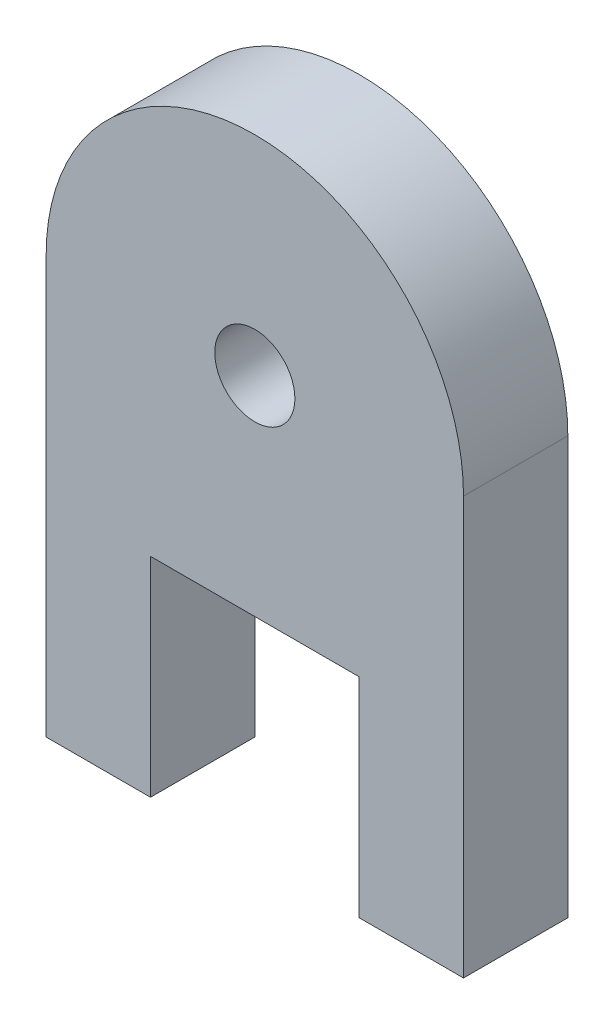
ISO-10303-21;
HEADER;
FILE_DESCRIPTION(('STEP AP214'),'2;1');
FILE_NAME('part.step','',(''),(''),'','','');
FILE_SCHEMA(('AUTOMOTIVE_DESIGN { 1 0 10303 214 1 1 1 1 }'));
ENDSEC;
DATA;
#1=APPLICATION_CONTEXT('core data for automotive mechanical design processes');
#2=APPLICATION_PROTOCOL_DEFINITION('international standard','automotive_design',2000,#1);
#3=PRODUCT_CONTEXT('',#1,'mechanical');
#4=PRODUCT('Part','Part','',(#3));
#5=PRODUCT_RELATED_PRODUCT_CATEGORY('part','',(#4));
#6=PRODUCT_DEFINITION_FORMATION('','',#4);
#7=PRODUCT_DEFINITION_CONTEXT('part definition',#1,'design');
#8=PRODUCT_DEFINITION('design','',#6,#7);
#9=PRODUCT_DEFINITION_SHAPE('','',#8);
#10=(LENGTH_UNIT() NAMED_UNIT(*) SI_UNIT(.MILLI.,.METRE.));
#11=(NAMED_UNIT(*) PLANE_ANGLE_UNIT() SI_UNIT($,.RADIAN.));
#12=(NAMED_UNIT(*) SI_UNIT($,.STERADIAN.) SOLID_ANGLE_UNIT());
#13=UNCERTAINTY_MEASURE_WITH_UNIT(LENGTH_MEASURE(1.E-05),#10,'distance_accuracy_value','');
#14=(GEOMETRIC_REPRESENTATION_CONTEXT(3) GLOBAL_UNCERTAINTY_ASSIGNED_CONTEXT((#13)) GLOBAL_UNIT_ASSIGNED_CONTEXT((#10,
#11,#12)) REPRESENTATION_CONTEXT('',''));
#15=CARTESIAN_POINT('',(0.,0.,0.));
#16=DIRECTION('',(0.,0.,1.));
#17=DIRECTION('',(1.,0.,0.));
#18=AXIS2_PLACEMENT_3D('',#15,#16,#17);
#19=CARTESIAN_POINT('',(-3.175,-6.35,1.5875));
#20=DIRECTION('',(0.,1.,0.));
#21=DIRECTION('',(0.,0.,1.));
#22=AXIS2_PLACEMENT_3D('',#19,#20,#21);
#23=PLANE('',#22);
#24=DIRECTION('',(1.,0.,0.));
#25=VECTOR('',#24,1.);
#26=CARTESIAN_POINT('',(-3.175,-6.35,1.5875));
#27=LINE('',#26,#25);
#28=CARTESIAN_POINT('',(1.5875,-6.35,1.5875));
#29=VERTEX_POINT('',#28);
#30=CARTESIAN_POINT('',(3.175,-6.35,1.5875));
#31=VERTEX_POINT('',#30);
#32=EDGE_CURVE('E126',#29,#31,#27,.T.);
#33=ORIENTED_EDGE('',*,*,#32,.F.);
#34=DIRECTION('',(0.,0.,-1.));
#35=VECTOR('',#34,1.);
#36=CARTESIAN_POINT('',(1.5875,-6.35,1.5875));
#37=LINE('',#36,#35);
#38=CARTESIAN_POINT('',(1.5875,-6.35,0.));
#39=VERTEX_POINT('',#38);
#40=EDGE_CURVE('E111',#29,#39,#37,.T.);
#41=ORIENTED_EDGE('',*,*,#40,.T.);
#42=DIRECTION('',(1.,0.,0.));
#43=VECTOR('',#42,1.);
#44=CARTESIAN_POINT('',(-3.175,-6.35,0.));
#45=LINE('',#44,#43);
#46=CARTESIAN_POINT('',(3.175,-6.35,0.));
#47=VERTEX_POINT('',#46);
#48=EDGE_CURVE('E147',#39,#47,#45,.T.);
#49=ORIENTED_EDGE('',*,*,#48,.T.);
#50=DIRECTION('',(0.,0.,-1.));
#51=VECTOR('',#50,1.);
#52=CARTESIAN_POINT('',(3.175,-6.35,1.5875));
#53=LINE('',#52,#51);
#54=EDGE_CURVE('E131',#31,#47,#53,.T.);
#55=ORIENTED_EDGE('',*,*,#54,.F.);
#56=EDGE_LOOP('',(#33,#41,#49,#55));
#57=FACE_BOUND('',#56,.T.);
#58=ADVANCED_FACE('F37',(#57),#23,.F.);
#59=CARTESIAN_POINT('',(0.,0.,1.5875));
#60=DIRECTION('',(0.,0.,-1.));
#61=DIRECTION('',(-1.,0.,0.));
#62=AXIS2_PLACEMENT_3D('',#59,#60,#61);
#63=PLANE('',#62);
#64=DIRECTION('',(1.,0.,0.));
#65=VECTOR('',#64,1.);
#66=CARTESIAN_POINT('',(1.5875,-3.175,1.5875));
#67=LINE('',#66,#65);
#68=CARTESIAN_POINT('',(-1.5875,-3.175,1.5875));
#69=VERTEX_POINT('',#68);
#70=CARTESIAN_POINT('',(1.5875,-3.175,1.5875));
#71=VERTEX_POINT('',#70);
#72=EDGE_CURVE('E122',#69,#71,#67,.T.);
#73=ORIENTED_EDGE('',*,*,#72,.T.);
#74=DIRECTION('',(0.,-1.,0.));
#75=VECTOR('',#74,1.);
#76=CARTESIAN_POINT('',(1.5875,-6.35,1.5875));
#77=LINE('',#76,#75);
#78=EDGE_CURVE('E114',#71,#29,#77,.T.);
#79=ORIENTED_EDGE('',*,*,#78,.T.);
#80=ORIENTED_EDGE('',*,*,#32,.T.);
#81=DIRECTION('',(0.,1.,0.));
#82=VECTOR('',#81,1.);
#83=CARTESIAN_POINT('',(3.175,-6.35,1.5875));
#84=LINE('',#83,#82);
#85=CARTESIAN_POINT('',(3.175,0.,1.5875));
#86=VERTEX_POINT('',#85);
#87=EDGE_CURVE('E61',#31,#86,#84,.T.);
#88=ORIENTED_EDGE('',*,*,#87,.T.);
#89=CARTESIAN_POINT('',(0.,0.,1.5875));
#90=DIRECTION('',(0.,0.,1.));
#91=DIRECTION('',(-1.,0.,0.));
#92=AXIS2_PLACEMENT_3D('',#89,#90,#91);
#93=CIRCLE('',#92,3.175);
#94=CARTESIAN_POINT('',(-3.175,0.,1.5875));
#95=VERTEX_POINT('',#94);
#96=EDGE_CURVE('E135',#86,#95,#93,.T.);
#97=ORIENTED_EDGE('',*,*,#96,.T.);
#98=DIRECTION('',(0.,-1.,0.));
#99=VECTOR('',#98,1.);
#100=CARTESIAN_POINT('',(-3.175,0.,1.5875));
#101=LINE('',#100,#99);
#102=CARTESIAN_POINT('',(-3.175,-6.35,1.5875));
#103=VERTEX_POINT('',#102);
#104=EDGE_CURVE('E89',#95,#103,#101,.T.);
#105=ORIENTED_EDGE('',*,*,#104,.T.);
#106=CARTESIAN_POINT('',(-1.5875,-6.35,1.5875));
#107=VERTEX_POINT('',#106);
#108=EDGE_CURVE('E132',#103,#107,#27,.T.);
#109=ORIENTED_EDGE('',*,*,#108,.T.);
#110=DIRECTION('',(0.,1.,0.));
#111=VECTOR('',#110,1.);
#112=CARTESIAN_POINT('',(-1.5875,-6.35,1.5875));
#113=LINE('',#112,#111);
#114=EDGE_CURVE('E52',#107,#69,#113,.T.);
#115=ORIENTED_EDGE('',*,*,#114,.T.);
#116=EDGE_LOOP('',(#73,#79,#80,#88,#97,#105,#109,#115));
#117=FACE_BOUND('',#116,.T.);
#118=CARTESIAN_POINT('',(0.,0.,1.5875));
#119=DIRECTION('',(0.,0.,1.));
#120=DIRECTION('',(1.,0.,0.));
#121=AXIS2_PLACEMENT_3D('',#118,#119,#120);
#122=CIRCLE('',#121,0.6096);
#123=CARTESIAN_POINT('',(0.6096,0.,1.5875));
#124=VERTEX_POINT('',#123);
#125=EDGE_CURVE('E145',#124,#124,#122,.T.);
#126=ORIENTED_EDGE('',*,*,#125,.F.);
#127=EDGE_LOOP('',(#126));
#128=FACE_BOUND('',#127,.T.);
#129=ADVANCED_FACE('F124',(#117,#128),#63,.F.);
#130=CARTESIAN_POINT('',(0.,0.,0.));
#131=DIRECTION('',(0.,0.,-1.));
#132=DIRECTION('',(-1.,0.,0.));
#133=AXIS2_PLACEMENT_3D('',#130,#131,#132);
#134=PLANE('',#133);
#135=DIRECTION('',(0.,-1.,0.));
#136=VECTOR('',#135,1.);
#137=CARTESIAN_POINT('',(1.5875,-6.35,0.));
#138=LINE('',#137,#136);
#139=CARTESIAN_POINT('',(1.5875,-3.175,0.));
#140=VERTEX_POINT('',#139);
#141=EDGE_CURVE('E117',#140,#39,#138,.T.);
#142=ORIENTED_EDGE('',*,*,#141,.F.);
#143=DIRECTION('',(1.,0.,0.));
#144=VECTOR('',#143,1.);
#145=CARTESIAN_POINT('',(1.5875,-3.175,0.));
#146=LINE('',#145,#144);
#147=CARTESIAN_POINT('',(-1.5875,-3.175,0.));
#148=VERTEX_POINT('',#147);
#149=EDGE_CURVE('E129',#148,#140,#146,.T.);
#150=ORIENTED_EDGE('',*,*,#149,.F.);
#151=DIRECTION('',(0.,1.,0.));
#152=VECTOR('',#151,1.);
#153=CARTESIAN_POINT('',(-1.5875,-6.35,0.));
#154=LINE('',#153,#152);
#155=CARTESIAN_POINT('',(-1.5875,-6.35,0.));
#156=VERTEX_POINT('',#155);
#157=EDGE_CURVE('E165',#156,#148,#154,.T.);
#158=ORIENTED_EDGE('',*,*,#157,.F.);
#159=CARTESIAN_POINT('',(-3.175,-6.35,0.));
#160=VERTEX_POINT('',#159);
#161=EDGE_CURVE('E148',#160,#156,#45,.T.);
#162=ORIENTED_EDGE('',*,*,#161,.F.);
#163=DIRECTION('',(0.,-1.,0.));
#164=VECTOR('',#163,1.);
#165=CARTESIAN_POINT('',(-3.175,0.,0.));
#166=LINE('',#165,#164);
#167=CARTESIAN_POINT('',(-3.175,0.,0.));
#168=VERTEX_POINT('',#167);
#169=EDGE_CURVE('E144',#168,#160,#166,.T.);
#170=ORIENTED_EDGE('',*,*,#169,.F.);
#171=CARTESIAN_POINT('',(0.,0.,0.));
#172=DIRECTION('',(0.,0.,1.));
#173=DIRECTION('',(-1.,0.,0.));
#174=AXIS2_PLACEMENT_3D('',#171,#172,#173);
#175=CIRCLE('',#174,3.175);
#176=CARTESIAN_POINT('',(3.175,0.,0.));
#177=VERTEX_POINT('',#176);
#178=EDGE_CURVE('E141',#177,#168,#175,.T.);
#179=ORIENTED_EDGE('',*,*,#178,.F.);
#180=DIRECTION('',(0.,1.,0.));
#181=VECTOR('',#180,1.);
#182=CARTESIAN_POINT('',(3.175,-6.35,0.));
#183=LINE('',#182,#181);
#184=EDGE_CURVE('E82',#47,#177,#183,.T.);
#185=ORIENTED_EDGE('',*,*,#184,.F.);
#186=ORIENTED_EDGE('',*,*,#48,.F.);
#187=EDGE_LOOP('',(#142,#150,#158,#162,#170,#179,#185,#186));
#188=FACE_BOUND('',#187,.T.);
#189=CARTESIAN_POINT('',(0.,0.,0.));
#190=DIRECTION('',(0.,0.,1.));
#191=DIRECTION('',(1.,0.,0.));
#192=AXIS2_PLACEMENT_3D('',#189,#190,#191);
#193=CIRCLE('',#192,0.6096);
#194=CARTESIAN_POINT('',(0.6096,0.,0.));
#195=VERTEX_POINT('',#194);
#196=EDGE_CURVE('E174',#195,#195,#193,.T.);
#197=ORIENTED_EDGE('',*,*,#196,.T.);
#198=EDGE_LOOP('',(#197));
#199=FACE_BOUND('',#198,.T.);
#200=ADVANCED_FACE('F160',(#188,#199),#134,.T.);
#201=CARTESIAN_POINT('',(0.,0.,1.5875));
#202=DIRECTION('',(0.,0.,-1.));
#203=DIRECTION('',(-1.,0.,0.));
#204=AXIS2_PLACEMENT_3D('',#201,#202,#203);
#205=CYLINDRICAL_SURFACE('',#204,3.175);
#206=ORIENTED_EDGE('',*,*,#178,.T.);
#207=DIRECTION('',(0.,0.,-1.));
#208=VECTOR('',#207,1.);
#209=CARTESIAN_POINT('',(-3.175,0.,1.5875));
#210=LINE('',#209,#208);
#211=EDGE_CURVE('E11',#95,#168,#210,.T.);
#212=ORIENTED_EDGE('',*,*,#211,.F.);
#213=ORIENTED_EDGE('',*,*,#96,.F.);
#214=DIRECTION('',(0.,0.,-1.));
#215=VECTOR('',#214,1.);
#216=CARTESIAN_POINT('',(3.175,0.,1.5875));
#217=LINE('',#216,#215);
#218=EDGE_CURVE('E140',#86,#177,#217,.T.);
#219=ORIENTED_EDGE('',*,*,#218,.T.);
#220=EDGE_LOOP('',(#206,#212,#213,#219));
#221=FACE_BOUND('',#220,.T.);
#222=ADVANCED_FACE('F39',(#221),#205,.T.);
#223=CARTESIAN_POINT('',(-3.175,0.,1.5875));
#224=DIRECTION('',(1.,0.,0.));
#225=DIRECTION('',(0.,1.,0.));
#226=AXIS2_PLACEMENT_3D('',#223,#224,#225);
#227=PLANE('',#226);
#228=ORIENTED_EDGE('',*,*,#169,.T.);
#229=DIRECTION('',(0.,0.,-1.));
#230=VECTOR('',#229,1.);
#231=CARTESIAN_POINT('',(-3.175,-6.35,1.5875));
#232=LINE('',#231,#230);
#233=EDGE_CURVE('E45',#103,#160,#232,.T.);
#234=ORIENTED_EDGE('',*,*,#233,.F.);
#235=ORIENTED_EDGE('',*,*,#104,.F.);
#236=ORIENTED_EDGE('',*,*,#211,.T.);
#237=EDGE_LOOP('',(#228,#234,#235,#236));
#238=FACE_BOUND('',#237,.T.);
#239=ADVANCED_FACE('F184',(#238),#227,.F.);
#240=ORIENTED_EDGE('',*,*,#161,.T.);
#241=DIRECTION('',(0.,0.,-1.));
#242=VECTOR('',#241,1.);
#243=CARTESIAN_POINT('',(-1.5875,-6.35,1.5875));
#244=LINE('',#243,#242);
#245=EDGE_CURVE('E121',#107,#156,#244,.T.);
#246=ORIENTED_EDGE('',*,*,#245,.F.);
#247=ORIENTED_EDGE('',*,*,#108,.F.);
#248=ORIENTED_EDGE('',*,*,#233,.T.);
#249=EDGE_LOOP('',(#240,#246,#247,#248));
#250=FACE_BOUND('',#249,.T.);
#251=ADVANCED_FACE('F157',(#250),#23,.F.);
#252=CARTESIAN_POINT('',(3.175,-6.35,1.5875));
#253=DIRECTION('',(-1.,0.,0.));
#254=DIRECTION('',(0.,-1.,0.));
#255=AXIS2_PLACEMENT_3D('',#252,#253,#254);
#256=PLANE('',#255);
#257=ORIENTED_EDGE('',*,*,#184,.T.);
#258=ORIENTED_EDGE('',*,*,#218,.F.);
#259=ORIENTED_EDGE('',*,*,#87,.F.);
#260=ORIENTED_EDGE('',*,*,#54,.T.);
#261=EDGE_LOOP('',(#257,#258,#259,#260));
#262=FACE_BOUND('',#261,.T.);
#263=ADVANCED_FACE('F190',(#262),#256,.F.);
#264=CARTESIAN_POINT('',(0.,0.,1.5875));
#265=DIRECTION('',(0.,0.,-1.));
#266=DIRECTION('',(-1.,0.,0.));
#267=AXIS2_PLACEMENT_3D('',#264,#265,#266);
#268=CYLINDRICAL_SURFACE('',#267,0.6096);
#269=ORIENTED_EDGE('',*,*,#125,.T.);
#270=EDGE_LOOP('',(#269));
#271=FACE_BOUND('',#270,.T.);
#272=ORIENTED_EDGE('',*,*,#196,.F.);
#273=EDGE_LOOP('',(#272));
#274=FACE_BOUND('',#273,.T.);
#275=ADVANCED_FACE('F200',(#271,#274),#268,.F.);
#276=CARTESIAN_POINT('',(1.5875,-6.35,1.5875));
#277=DIRECTION('',(1.,0.,0.));
#278=DIRECTION('',(0.,0.,-1.));
#279=AXIS2_PLACEMENT_3D('',#276,#277,#278);
#280=PLANE('',#279);
#281=ORIENTED_EDGE('',*,*,#141,.T.);
#282=ORIENTED_EDGE('',*,*,#40,.F.);
#283=ORIENTED_EDGE('',*,*,#78,.F.);
#284=DIRECTION('',(0.,0.,-1.));
#285=VECTOR('',#284,1.);
#286=CARTESIAN_POINT('',(1.5875,-3.175,1.5875));
#287=LINE('',#286,#285);
#288=EDGE_CURVE('E172',#71,#140,#287,.T.);
#289=ORIENTED_EDGE('',*,*,#288,.T.);
#290=EDGE_LOOP('',(#281,#282,#283,#289));
#291=FACE_BOUND('',#290,.T.);
#292=ADVANCED_FACE('F113',(#291),#280,.F.);
#293=CARTESIAN_POINT('',(1.5875,-3.175,1.5875));
#294=DIRECTION('',(0.,1.,0.));
#295=DIRECTION('',(0.,0.,1.));
#296=AXIS2_PLACEMENT_3D('',#293,#294,#295);
#297=PLANE('',#296);
#298=ORIENTED_EDGE('',*,*,#149,.T.);
#299=ORIENTED_EDGE('',*,*,#288,.F.);
#300=ORIENTED_EDGE('',*,*,#72,.F.);
#301=DIRECTION('',(0.,0.,-1.));
#302=VECTOR('',#301,1.);
#303=CARTESIAN_POINT('',(-1.5875,-3.175,1.5875));
#304=LINE('',#303,#302);
#305=EDGE_CURVE('E175',#69,#148,#304,.T.);
#306=ORIENTED_EDGE('',*,*,#305,.T.);
#307=EDGE_LOOP('',(#298,#299,#300,#306));
#308=FACE_BOUND('',#307,.T.);
#309=ADVANCED_FACE('F208',(#308),#297,.F.);
#310=CARTESIAN_POINT('',(-1.5875,-6.35,1.5875));
#311=DIRECTION('',(-1.,0.,0.));
#312=DIRECTION('',(0.,0.,1.));
#313=AXIS2_PLACEMENT_3D('',#310,#311,#312);
#314=PLANE('',#313);
#315=ORIENTED_EDGE('',*,*,#157,.T.);
#316=ORIENTED_EDGE('',*,*,#305,.F.);
#317=ORIENTED_EDGE('',*,*,#114,.F.);
#318=ORIENTED_EDGE('',*,*,#245,.T.);
#319=EDGE_LOOP('',(#315,#316,#317,#318));
#320=FACE_BOUND('',#319,.T.);
#321=ADVANCED_FACE('F209',(#320),#314,.F.);
#322=CLOSED_SHELL('',(#58,#129,#200,#222,#239,#251,#263,#275,#292,#309,#321));
#323=MANIFOLD_SOLID_BREP('B2',#322);
#324=ADVANCED_BREP_SHAPE_REPRESENTATION('',(#18,#323),#14);
#325=SHAPE_DEFINITION_REPRESENTATION(#9,#324);
ENDSEC;
END-ISO-10303-21;
